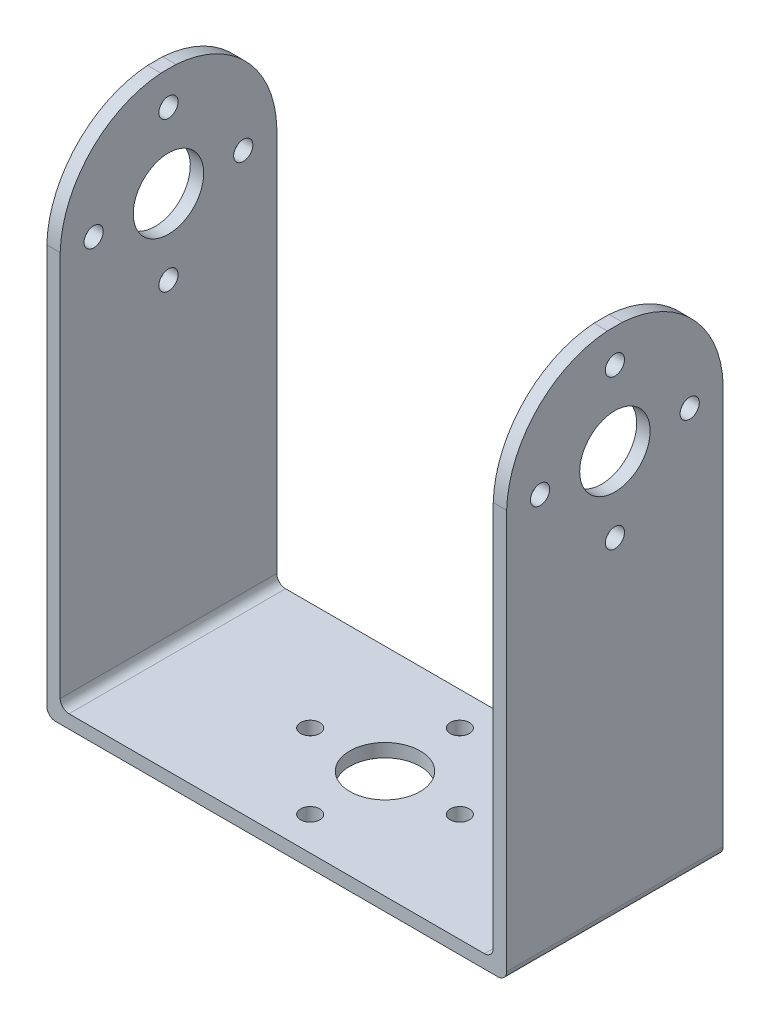
ISO-10303-21;
HEADER;
FILE_DESCRIPTION(('STEP AP214'),'2;1');
FILE_NAME('part.step','',(''),(''),'','','');
FILE_SCHEMA(('AUTOMOTIVE_DESIGN { 1 0 10303 214 1 1 1 1 }'));
ENDSEC;
DATA;
#1=APPLICATION_CONTEXT('core data for automotive mechanical design processes');
#2=APPLICATION_PROTOCOL_DEFINITION('international standard','automotive_design',2000,#1);
#3=PRODUCT_CONTEXT('',#1,'mechanical');
#4=PRODUCT('Part','Part','',(#3));
#5=PRODUCT_RELATED_PRODUCT_CATEGORY('part','',(#4));
#6=PRODUCT_DEFINITION_FORMATION('','',#4);
#7=PRODUCT_DEFINITION_CONTEXT('part definition',#1,'design');
#8=PRODUCT_DEFINITION('design','',#6,#7);
#9=PRODUCT_DEFINITION_SHAPE('','',#8);
#10=(LENGTH_UNIT() NAMED_UNIT(*) SI_UNIT(.MILLI.,.METRE.));
#11=(NAMED_UNIT(*) PLANE_ANGLE_UNIT() SI_UNIT($,.RADIAN.));
#12=(NAMED_UNIT(*) SI_UNIT($,.STERADIAN.) SOLID_ANGLE_UNIT());
#13=UNCERTAINTY_MEASURE_WITH_UNIT(LENGTH_MEASURE(1.E-05),#10,'distance_accuracy_value','');
#14=(GEOMETRIC_REPRESENTATION_CONTEXT(3) GLOBAL_UNCERTAINTY_ASSIGNED_CONTEXT((#13)) GLOBAL_UNIT_ASSIGNED_CONTEXT((#10,
#11,#12)) REPRESENTATION_CONTEXT('',''));
#15=CARTESIAN_POINT('',(0.,0.,0.));
#16=DIRECTION('',(0.,0.,1.));
#17=DIRECTION('',(1.,0.,0.));
#18=AXIS2_PLACEMENT_3D('',#15,#16,#17);
#19=CARTESIAN_POINT('',(-24.605,58.34,24.61));
#20=DIRECTION('',(0.,-1.,0.));
#21=DIRECTION('',(0.,0.,-1.));
#22=AXIS2_PLACEMENT_3D('',#19,#20,#21);
#23=PLANE('',#22);
#24=DIRECTION('',(-1.,0.,0.));
#25=VECTOR('',#24,1.);
#26=CARTESIAN_POINT('',(-6.125,58.34,13.1638946384744));
#27=LINE('',#26,#25);
#28=CARTESIAN_POINT('',(-24.605,58.34,13.1638946384744));
#29=VERTEX_POINT('',#28);
#30=CARTESIAN_POINT('',(-26.125,58.34,13.1638946384744));
#31=VERTEX_POINT('',#30);
#32=EDGE_CURVE('E368',#29,#31,#27,.T.);
#33=ORIENTED_EDGE('',*,*,#32,.F.);
#34=DIRECTION('',(0.,0.,-1.));
#35=VECTOR('',#34,1.);
#36=CARTESIAN_POINT('',(-24.605,58.34,24.61));
#37=LINE('',#36,#35);
#38=CARTESIAN_POINT('',(-24.605,58.34,11.4461053615256));
#39=VERTEX_POINT('',#38);
#40=EDGE_CURVE('E225',#29,#39,#37,.T.);
#41=ORIENTED_EDGE('',*,*,#40,.T.);
#42=DIRECTION('',(-1.,0.,0.));
#43=VECTOR('',#42,1.);
#44=CARTESIAN_POINT('',(-6.125,58.34,11.4461053615256));
#45=LINE('',#44,#43);
#46=CARTESIAN_POINT('',(-26.125,58.34,11.4461053615256));
#47=VERTEX_POINT('',#46);
#48=EDGE_CURVE('E373',#39,#47,#45,.T.);
#49=ORIENTED_EDGE('',*,*,#48,.T.);
#50=DIRECTION('',(0.,0.,-1.));
#51=VECTOR('',#50,1.);
#52=CARTESIAN_POINT('',(-26.125,58.34,24.61));
#53=LINE('',#52,#51);
#54=EDGE_CURVE('E221',#31,#47,#53,.T.);
#55=ORIENTED_EDGE('',*,*,#54,.F.);
#56=EDGE_LOOP('',(#33,#41,#49,#55));
#57=FACE_BOUND('',#56,.T.);
#58=ADVANCED_FACE('F83',(#57),#23,.F.);
#59=CARTESIAN_POINT('',(-26.125,58.34,24.61));
#60=DIRECTION('',(1.,0.,0.));
#61=DIRECTION('',(0.,1.,0.));
#62=AXIS2_PLACEMENT_3D('',#59,#60,#61);
#63=PLANE('',#62);
#64=CARTESIAN_POINT('',(-26.125,46.0600000000001,20.805));
#65=DIRECTION('',(-1.,0.,0.));
#66=DIRECTION('',(0.,0.,-1.));
#67=AXIS2_PLACEMENT_3D('',#64,#65,#66);
#68=CIRCLE('',#67,1.09);
#69=CARTESIAN_POINT('',(-26.125,46.0600000000001,19.715));
#70=VERTEX_POINT('',#69);
#71=EDGE_CURVE('E539',#70,#70,#68,.T.);
#72=ORIENTED_EDGE('',*,*,#71,.F.);
#73=EDGE_LOOP('',(#72));
#74=FACE_BOUND('',#73,.T.);
#75=CARTESIAN_POINT('',(-26.125,37.56,12.305));
#76=DIRECTION('',(-1.,0.,0.));
#77=DIRECTION('',(0.,1.,0.));
#78=AXIS2_PLACEMENT_3D('',#75,#76,#77);
#79=CIRCLE('',#78,1.09);
#80=CARTESIAN_POINT('',(-26.125,38.65,12.305));
#81=VERTEX_POINT('',#80);
#82=EDGE_CURVE('E545',#81,#81,#79,.T.);
#83=ORIENTED_EDGE('',*,*,#82,.F.);
#84=EDGE_LOOP('',(#83));
#85=FACE_BOUND('',#84,.T.);
#86=CARTESIAN_POINT('',(-26.125,46.06,3.805));
#87=DIRECTION('',(-1.,0.,0.));
#88=DIRECTION('',(0.,0.,1.));
#89=AXIS2_PLACEMENT_3D('',#86,#87,#88);
#90=CIRCLE('',#89,1.09);
#91=CARTESIAN_POINT('',(-26.125,46.06,4.895));
#92=VERTEX_POINT('',#91);
#93=EDGE_CURVE('E551',#92,#92,#90,.T.);
#94=ORIENTED_EDGE('',*,*,#93,.F.);
#95=EDGE_LOOP('',(#94));
#96=FACE_BOUND('',#95,.T.);
#97=CARTESIAN_POINT('',(-26.125,54.56,12.305));
#98=DIRECTION('',(-1.,0.,0.));
#99=DIRECTION('',(0.,-1.,0.));
#100=AXIS2_PLACEMENT_3D('',#97,#98,#99);
#101=CIRCLE('',#100,1.09);
#102=CARTESIAN_POINT('',(-26.125,53.47,12.305));
#103=VERTEX_POINT('',#102);
#104=EDGE_CURVE('E251',#103,#103,#101,.T.);
#105=ORIENTED_EDGE('',*,*,#104,.F.);
#106=EDGE_LOOP('',(#105));
#107=FACE_BOUND('',#106,.T.);
#108=CARTESIAN_POINT('',(-26.125,46.06,12.305));
#109=DIRECTION('',(-1.,0.,0.));
#110=DIRECTION('',(0.,0.,1.));
#111=AXIS2_PLACEMENT_3D('',#108,#109,#110);
#112=CIRCLE('',#111,4.);
#113=CARTESIAN_POINT('',(-26.125,46.06,16.305));
#114=VERTEX_POINT('',#113);
#115=EDGE_CURVE('E238',#114,#114,#112,.T.);
#116=ORIENTED_EDGE('',*,*,#115,.F.);
#117=EDGE_LOOP('',(#116));
#118=FACE_BOUND('',#117,.T.);
#119=DIRECTION('',(0.,-1.,0.));
#120=VECTOR('',#119,1.);
#121=CARTESIAN_POINT('',(-26.125,58.34,0.));
#122=LINE('',#121,#120);
#123=CARTESIAN_POINT('',(-26.125,46.4108204669057,0.));
#124=VERTEX_POINT('',#123);
#125=CARTESIAN_POINT('',(-26.125,1.00000000000001,0.));
#126=VERTEX_POINT('',#125);
#127=EDGE_CURVE('E323',#124,#126,#122,.T.);
#128=ORIENTED_EDGE('',*,*,#127,.T.);
#129=DIRECTION('',(0.,0.,-1.));
#130=VECTOR('',#129,1.);
#131=CARTESIAN_POINT('',(-26.125,1.,24.61));
#132=LINE('',#131,#130);
#133=CARTESIAN_POINT('',(-26.125,1.00000000000001,24.61));
#134=VERTEX_POINT('',#133);
#135=EDGE_CURVE('E98',#126,#134,#132,.F.);
#136=ORIENTED_EDGE('',*,*,#135,.T.);
#137=DIRECTION('',(0.,-1.,0.));
#138=VECTOR('',#137,1.);
#139=CARTESIAN_POINT('',(-26.125,58.34,24.61));
#140=LINE('',#139,#138);
#141=CARTESIAN_POINT('',(-26.125,46.4108204669058,24.61));
#142=VERTEX_POINT('',#141);
#143=EDGE_CURVE('E333',#142,#134,#140,.T.);
#144=ORIENTED_EDGE('',*,*,#143,.F.);
#145=CARTESIAN_POINT('',(-26.125,46.06,12.305));
#146=DIRECTION('',(-1.,0.,0.));
#147=DIRECTION('',(0.,0.,1.));
#148=AXIS2_PLACEMENT_3D('',#145,#146,#147);
#149=CIRCLE('',#148,12.31);
#150=EDGE_CURVE('E237',#142,#31,#149,.T.);
#151=ORIENTED_EDGE('',*,*,#150,.T.);
#152=ORIENTED_EDGE('',*,*,#54,.T.);
#153=CARTESIAN_POINT('',(-26.125,46.06,12.305));
#154=DIRECTION('',(-1.,0.,0.));
#155=DIRECTION('',(0.,0.,1.));
#156=AXIS2_PLACEMENT_3D('',#153,#154,#155);
#157=CIRCLE('',#156,12.31);
#158=EDGE_CURVE('E371',#47,#124,#157,.T.);
#159=ORIENTED_EDGE('',*,*,#158,.T.);
#160=EDGE_LOOP('',(#128,#136,#144,#151,#152,#159));
#161=FACE_BOUND('',#160,.T.);
#162=ADVANCED_FACE('F383',(#74,#85,#96,#107,#118,#161),#63,.F.);
#163=CARTESIAN_POINT('',(-24.605,1.51999999999999,24.61));
#164=DIRECTION('',(-1.,0.,0.));
#165=DIRECTION('',(0.,-1.,0.));
#166=AXIS2_PLACEMENT_3D('',#163,#164,#165);
#167=PLANE('',#166);
#168=CARTESIAN_POINT('',(-24.605,46.0600000000001,20.805));
#169=DIRECTION('',(-1.,0.,0.));
#170=DIRECTION('',(0.,0.,-1.));
#171=AXIS2_PLACEMENT_3D('',#168,#169,#170);
#172=CIRCLE('',#171,1.09);
#173=CARTESIAN_POINT('',(-24.605,46.0600000000001,19.715));
#174=VERTEX_POINT('',#173);
#175=EDGE_CURVE('E542',#174,#174,#172,.T.);
#176=ORIENTED_EDGE('',*,*,#175,.T.);
#177=EDGE_LOOP('',(#176));
#178=FACE_BOUND('',#177,.T.);
#179=CARTESIAN_POINT('',(-24.605,37.56,12.305));
#180=DIRECTION('',(-1.,0.,0.));
#181=DIRECTION('',(0.,1.,0.));
#182=AXIS2_PLACEMENT_3D('',#179,#180,#181);
#183=CIRCLE('',#182,1.09);
#184=CARTESIAN_POINT('',(-24.605,38.65,12.305));
#185=VERTEX_POINT('',#184);
#186=EDGE_CURVE('E548',#185,#185,#183,.T.);
#187=ORIENTED_EDGE('',*,*,#186,.T.);
#188=EDGE_LOOP('',(#187));
#189=FACE_BOUND('',#188,.T.);
#190=CARTESIAN_POINT('',(-24.605,46.06,3.805));
#191=DIRECTION('',(-1.,0.,0.));
#192=DIRECTION('',(0.,0.,1.));
#193=AXIS2_PLACEMENT_3D('',#190,#191,#192);
#194=CIRCLE('',#193,1.09);
#195=CARTESIAN_POINT('',(-24.605,46.06,4.895));
#196=VERTEX_POINT('',#195);
#197=EDGE_CURVE('E554',#196,#196,#194,.T.);
#198=ORIENTED_EDGE('',*,*,#197,.T.);
#199=EDGE_LOOP('',(#198));
#200=FACE_BOUND('',#199,.T.);
#201=CARTESIAN_POINT('',(-24.605,54.56,12.305));
#202=DIRECTION('',(-1.,0.,0.));
#203=DIRECTION('',(0.,-1.,0.));
#204=AXIS2_PLACEMENT_3D('',#201,#202,#203);
#205=CIRCLE('',#204,1.09);
#206=CARTESIAN_POINT('',(-24.605,53.47,12.305));
#207=VERTEX_POINT('',#206);
#208=EDGE_CURVE('E561',#207,#207,#205,.T.);
#209=ORIENTED_EDGE('',*,*,#208,.T.);
#210=EDGE_LOOP('',(#209));
#211=FACE_BOUND('',#210,.T.);
#212=CARTESIAN_POINT('',(-24.605,46.06,12.305));
#213=DIRECTION('',(-1.,0.,0.));
#214=DIRECTION('',(0.,-1.,0.));
#215=AXIS2_PLACEMENT_3D('',#212,#213,#214);
#216=CIRCLE('',#215,4.);
#217=CARTESIAN_POINT('',(-24.605,42.06,12.305));
#218=VERTEX_POINT('',#217);
#219=EDGE_CURVE('E234',#218,#218,#216,.T.);
#220=ORIENTED_EDGE('',*,*,#219,.T.);
#221=EDGE_LOOP('',(#220));
#222=FACE_BOUND('',#221,.T.);
#223=DIRECTION('',(0.,1.,0.));
#224=VECTOR('',#223,1.);
#225=CARTESIAN_POINT('',(-24.605,1.51999999999999,24.61));
#226=LINE('',#225,#224);
#227=CARTESIAN_POINT('',(-24.605,2.51999999999999,24.61));
#228=VERTEX_POINT('',#227);
#229=CARTESIAN_POINT('',(-24.605,46.4108204669057,24.61));
#230=VERTEX_POINT('',#229);
#231=EDGE_CURVE('E313',#228,#230,#226,.T.);
#232=ORIENTED_EDGE('',*,*,#231,.F.);
#233=DIRECTION('',(0.,0.,-1.));
#234=VECTOR('',#233,1.);
#235=CARTESIAN_POINT('',(-24.605,2.51999999999999,0.));
#236=LINE('',#235,#234);
#237=CARTESIAN_POINT('',(-24.605,2.51999999999999,0.));
#238=VERTEX_POINT('',#237);
#239=EDGE_CURVE('E284',#228,#238,#236,.T.);
#240=ORIENTED_EDGE('',*,*,#239,.T.);
#241=DIRECTION('',(0.,1.,0.));
#242=VECTOR('',#241,1.);
#243=CARTESIAN_POINT('',(-24.605,1.51999999999999,0.));
#244=LINE('',#243,#242);
#245=CARTESIAN_POINT('',(-24.605,46.4108204669057,0.));
#246=VERTEX_POINT('',#245);
#247=EDGE_CURVE('E298',#238,#246,#244,.T.);
#248=ORIENTED_EDGE('',*,*,#247,.T.);
#249=CARTESIAN_POINT('',(-24.605,46.06,12.305));
#250=DIRECTION('',(-1.,0.,0.));
#251=DIRECTION('',(0.,-1.,0.));
#252=AXIS2_PLACEMENT_3D('',#249,#250,#251);
#253=CIRCLE('',#252,12.31);
#254=EDGE_CURVE('E326',#39,#246,#253,.T.);
#255=ORIENTED_EDGE('',*,*,#254,.F.);
#256=ORIENTED_EDGE('',*,*,#40,.F.);
#257=CARTESIAN_POINT('',(-24.605,46.06,12.305));
#258=DIRECTION('',(-1.,0.,0.));
#259=DIRECTION('',(0.,-1.,0.));
#260=AXIS2_PLACEMENT_3D('',#257,#258,#259);
#261=CIRCLE('',#260,12.31);
#262=EDGE_CURVE('E315',#230,#29,#261,.T.);
#263=ORIENTED_EDGE('',*,*,#262,.F.);
#264=EDGE_LOOP('',(#232,#240,#248,#255,#256,#263));
#265=FACE_BOUND('',#264,.T.);
#266=ADVANCED_FACE('F309',(#178,#189,#200,#211,#222,#265),#167,.F.);
#267=CARTESIAN_POINT('',(0.,0.,24.61));
#268=DIRECTION('',(0.,0.,1.));
#269=DIRECTION('',(1.,0.,0.));
#270=AXIS2_PLACEMENT_3D('',#267,#268,#269);
#271=PLANE('',#270);
#272=DIRECTION('',(1.,0.,0.));
#273=VECTOR('',#272,1.);
#274=CARTESIAN_POINT('',(-26.125,0.,24.61));
#275=LINE('',#274,#273);
#276=CARTESIAN_POINT('',(-25.125,0.,24.61));
#277=VERTEX_POINT('',#276);
#278=CARTESIAN_POINT('',(25.125,0.,24.61));
#279=VERTEX_POINT('',#278);
#280=EDGE_CURVE('E334',#277,#279,#275,.T.);
#281=ORIENTED_EDGE('',*,*,#280,.T.);
#282=CARTESIAN_POINT('',(25.125,1.,24.61));
#283=DIRECTION('',(0.,0.,1.));
#284=DIRECTION('',(1.,0.,0.));
#285=AXIS2_PLACEMENT_3D('',#282,#283,#284);
#286=CIRCLE('',#285,1.);
#287=CARTESIAN_POINT('',(26.125,1.,24.61));
#288=VERTEX_POINT('',#287);
#289=EDGE_CURVE('E274',#279,#288,#286,.T.);
#290=ORIENTED_EDGE('',*,*,#289,.T.);
#291=DIRECTION('',(0.,1.,0.));
#292=VECTOR('',#291,1.);
#293=CARTESIAN_POINT('',(26.125,0.,24.61));
#294=LINE('',#293,#292);
#295=CARTESIAN_POINT('',(26.125,46.4108204669058,24.61));
#296=VERTEX_POINT('',#295);
#297=EDGE_CURVE('E338',#288,#296,#294,.T.);
#298=ORIENTED_EDGE('',*,*,#297,.T.);
#299=DIRECTION('',(1.,0.,0.));
#300=VECTOR('',#299,1.);
#301=CARTESIAN_POINT('',(6.125,46.4108204669057,24.61));
#302=LINE('',#301,#300);
#303=CARTESIAN_POINT('',(24.605,46.4108204669057,24.61));
#304=VERTEX_POINT('',#303);
#305=EDGE_CURVE('E203',#304,#296,#302,.T.);
#306=ORIENTED_EDGE('',*,*,#305,.F.);
#307=DIRECTION('',(0.,-1.,0.));
#308=VECTOR('',#307,1.);
#309=CARTESIAN_POINT('',(24.605,58.34,24.61));
#310=LINE('',#309,#308);
#311=CARTESIAN_POINT('',(24.605,2.52,24.61));
#312=VERTEX_POINT('',#311);
#313=EDGE_CURVE('E319',#304,#312,#310,.T.);
#314=ORIENTED_EDGE('',*,*,#313,.T.);
#315=CARTESIAN_POINT('',(23.605,2.52,24.61));
#316=DIRECTION('',(0.,0.,1.));
#317=DIRECTION('',(1.,0.,0.));
#318=AXIS2_PLACEMENT_3D('',#315,#316,#317);
#319=CIRCLE('',#318,1.);
#320=CARTESIAN_POINT('',(23.605,1.52,24.61));
#321=VERTEX_POINT('',#320);
#322=EDGE_CURVE('E289',#312,#321,#319,.F.);
#323=ORIENTED_EDGE('',*,*,#322,.T.);
#324=DIRECTION('',(-1.,0.,0.));
#325=VECTOR('',#324,1.);
#326=CARTESIAN_POINT('',(24.605,1.52,24.61));
#327=LINE('',#326,#325);
#328=CARTESIAN_POINT('',(-23.605,1.51999999999999,24.61));
#329=VERTEX_POINT('',#328);
#330=EDGE_CURVE('E317',#321,#329,#327,.T.);
#331=ORIENTED_EDGE('',*,*,#330,.T.);
#332=CARTESIAN_POINT('',(-23.605,2.51999999999999,24.61));
#333=DIRECTION('',(0.,0.,1.));
#334=DIRECTION('',(1.,0.,0.));
#335=AXIS2_PLACEMENT_3D('',#332,#333,#334);
#336=CIRCLE('',#335,1.);
#337=EDGE_CURVE('E12',#329,#228,#336,.F.);
#338=ORIENTED_EDGE('',*,*,#337,.T.);
#339=ORIENTED_EDGE('',*,*,#231,.T.);
#340=DIRECTION('',(-1.,0.,0.));
#341=VECTOR('',#340,1.);
#342=CARTESIAN_POINT('',(-6.125,46.4108204669057,24.61));
#343=LINE('',#342,#341);
#344=EDGE_CURVE('E230',#230,#142,#343,.T.);
#345=ORIENTED_EDGE('',*,*,#344,.T.);
#346=ORIENTED_EDGE('',*,*,#143,.T.);
#347=CARTESIAN_POINT('',(-25.125,1.,24.61));
#348=DIRECTION('',(0.,0.,1.));
#349=DIRECTION('',(1.,0.,0.));
#350=AXIS2_PLACEMENT_3D('',#347,#348,#349);
#351=CIRCLE('',#350,1.);
#352=EDGE_CURVE('E272',#134,#277,#351,.T.);
#353=ORIENTED_EDGE('',*,*,#352,.T.);
#354=EDGE_LOOP('',(#281,#290,#298,#306,#314,#323,#331,#338,#339,#345,#346,#353));
#355=FACE_BOUND('',#354,.T.);
#356=ADVANCED_FACE('F346',(#355),#271,.T.);
#357=CARTESIAN_POINT('',(0.,0.,0.));
#358=DIRECTION('',(0.,0.,1.));
#359=DIRECTION('',(1.,0.,0.));
#360=AXIS2_PLACEMENT_3D('',#357,#358,#359);
#361=PLANE('',#360);
#362=DIRECTION('',(0.,1.,0.));
#363=VECTOR('',#362,1.);
#364=CARTESIAN_POINT('',(26.125,0.,0.));
#365=LINE('',#364,#363);
#366=CARTESIAN_POINT('',(26.125,1.,0.));
#367=VERTEX_POINT('',#366);
#368=CARTESIAN_POINT('',(26.125,46.4108204669058,0.));
#369=VERTEX_POINT('',#368);
#370=EDGE_CURVE('E329',#367,#369,#365,.T.);
#371=ORIENTED_EDGE('',*,*,#370,.F.);
#372=CARTESIAN_POINT('',(25.125,1.,0.));
#373=DIRECTION('',(0.,0.,1.));
#374=DIRECTION('',(1.,0.,0.));
#375=AXIS2_PLACEMENT_3D('',#372,#373,#374);
#376=CIRCLE('',#375,1.);
#377=CARTESIAN_POINT('',(25.125,0.,0.));
#378=VERTEX_POINT('',#377);
#379=EDGE_CURVE('E265',#367,#378,#376,.F.);
#380=ORIENTED_EDGE('',*,*,#379,.T.);
#381=DIRECTION('',(1.,0.,0.));
#382=VECTOR('',#381,1.);
#383=CARTESIAN_POINT('',(-26.125,0.,0.));
#384=LINE('',#383,#382);
#385=CARTESIAN_POINT('',(-25.125,0.,0.));
#386=VERTEX_POINT('',#385);
#387=EDGE_CURVE('E325',#386,#378,#384,.T.);
#388=ORIENTED_EDGE('',*,*,#387,.F.);
#389=CARTESIAN_POINT('',(-25.125,1.,0.));
#390=DIRECTION('',(0.,0.,1.));
#391=DIRECTION('',(1.,0.,0.));
#392=AXIS2_PLACEMENT_3D('',#389,#390,#391);
#393=CIRCLE('',#392,1.);
#394=EDGE_CURVE('E263',#386,#126,#393,.F.);
#395=ORIENTED_EDGE('',*,*,#394,.T.);
#396=ORIENTED_EDGE('',*,*,#127,.F.);
#397=DIRECTION('',(-1.,0.,0.));
#398=VECTOR('',#397,1.);
#399=CARTESIAN_POINT('',(-6.125,46.4108204669057,0.));
#400=LINE('',#399,#398);
#401=EDGE_CURVE('E223',#246,#124,#400,.T.);
#402=ORIENTED_EDGE('',*,*,#401,.F.);
#403=ORIENTED_EDGE('',*,*,#247,.F.);
#404=CARTESIAN_POINT('',(-23.605,2.51999999999999,0.));
#405=DIRECTION('',(0.,0.,1.));
#406=DIRECTION('',(1.,0.,0.));
#407=AXIS2_PLACEMENT_3D('',#404,#405,#406);
#408=CIRCLE('',#407,1.);
#409=CARTESIAN_POINT('',(-23.605,1.51999999999999,0.));
#410=VERTEX_POINT('',#409);
#411=EDGE_CURVE('E91',#238,#410,#408,.T.);
#412=ORIENTED_EDGE('',*,*,#411,.T.);
#413=DIRECTION('',(-1.,0.,0.));
#414=VECTOR('',#413,1.);
#415=CARTESIAN_POINT('',(24.605,1.52,0.));
#416=LINE('',#415,#414);
#417=CARTESIAN_POINT('',(23.605,1.52,0.));
#418=VERTEX_POINT('',#417);
#419=EDGE_CURVE('E296',#418,#410,#416,.T.);
#420=ORIENTED_EDGE('',*,*,#419,.F.);
#421=CARTESIAN_POINT('',(23.605,2.52,0.));
#422=DIRECTION('',(0.,0.,1.));
#423=DIRECTION('',(1.,0.,0.));
#424=AXIS2_PLACEMENT_3D('',#421,#422,#423);
#425=CIRCLE('',#424,1.);
#426=CARTESIAN_POINT('',(24.605,2.52,0.));
#427=VERTEX_POINT('',#426);
#428=EDGE_CURVE('E287',#418,#427,#425,.T.);
#429=ORIENTED_EDGE('',*,*,#428,.T.);
#430=DIRECTION('',(0.,-1.,0.));
#431=VECTOR('',#430,1.);
#432=CARTESIAN_POINT('',(24.605,58.34,0.));
#433=LINE('',#432,#431);
#434=CARTESIAN_POINT('',(24.605,46.4108204669057,0.));
#435=VERTEX_POINT('',#434);
#436=EDGE_CURVE('E306',#435,#427,#433,.T.);
#437=ORIENTED_EDGE('',*,*,#436,.F.);
#438=DIRECTION('',(1.,0.,0.));
#439=VECTOR('',#438,1.);
#440=CARTESIAN_POINT('',(6.125,46.4108204669057,0.));
#441=LINE('',#440,#439);
#442=EDGE_CURVE('E358',#435,#369,#441,.T.);
#443=ORIENTED_EDGE('',*,*,#442,.T.);
#444=EDGE_LOOP('',(#371,#380,#388,#395,#396,#402,#403,#412,#420,#429,#437,#443));
#445=FACE_BOUND('',#444,.T.);
#446=ADVANCED_FACE('F295',(#445),#361,.F.);
#447=CARTESIAN_POINT('',(-26.125,0.,24.61));
#448=DIRECTION('',(0.,1.,0.));
#449=DIRECTION('',(0.,0.,1.));
#450=AXIS2_PLACEMENT_3D('',#447,#448,#449);
#451=PLANE('',#450);
#452=CARTESIAN_POINT('',(-8.49999999999999,0.,12.3049999999999));
#453=DIRECTION('',(0.,1.,0.));
#454=DIRECTION('',(1.,0.,0.));
#455=AXIS2_PLACEMENT_3D('',#452,#453,#454);
#456=CIRCLE('',#455,1.09);
#457=CARTESIAN_POINT('',(-7.40999999999999,0.,12.3049999999999));
#458=VERTEX_POINT('',#457);
#459=EDGE_CURVE('E511',#458,#458,#456,.T.);
#460=ORIENTED_EDGE('',*,*,#459,.T.);
#461=EDGE_LOOP('',(#460));
#462=FACE_BOUND('',#461,.T.);
#463=CARTESIAN_POINT('',(0.,0.,20.805));
#464=DIRECTION('',(0.,1.,0.));
#465=DIRECTION('',(0.,0.,-1.));
#466=AXIS2_PLACEMENT_3D('',#463,#464,#465);
#467=CIRCLE('',#466,1.09);
#468=CARTESIAN_POINT('',(0.,0.,19.715));
#469=VERTEX_POINT('',#468);
#470=EDGE_CURVE('E505',#469,#469,#467,.T.);
#471=ORIENTED_EDGE('',*,*,#470,.T.);
#472=EDGE_LOOP('',(#471));
#473=FACE_BOUND('',#472,.T.);
#474=CARTESIAN_POINT('',(8.50000000000001,0.,12.305));
#475=DIRECTION('',(0.,1.,0.));
#476=DIRECTION('',(-1.,0.,0.));
#477=AXIS2_PLACEMENT_3D('',#474,#475,#476);
#478=CIRCLE('',#477,1.09);
#479=CARTESIAN_POINT('',(7.41000000000001,0.,12.305));
#480=VERTEX_POINT('',#479);
#481=EDGE_CURVE('E260',#480,#480,#478,.T.);
#482=ORIENTED_EDGE('',*,*,#481,.T.);
#483=EDGE_LOOP('',(#482));
#484=FACE_BOUND('',#483,.T.);
#485=CARTESIAN_POINT('',(0.,0.,3.805));
#486=DIRECTION('',(0.,1.,0.));
#487=DIRECTION('',(0.,0.,1.));
#488=AXIS2_PLACEMENT_3D('',#485,#486,#487);
#489=CIRCLE('',#488,1.09);
#490=CARTESIAN_POINT('',(0.,0.,4.895));
#491=VERTEX_POINT('',#490);
#492=EDGE_CURVE('E256',#491,#491,#489,.T.);
#493=ORIENTED_EDGE('',*,*,#492,.T.);
#494=EDGE_LOOP('',(#493));
#495=FACE_BOUND('',#494,.T.);
#496=CARTESIAN_POINT('',(0.,0.,12.305));
#497=DIRECTION('',(0.,1.,0.));
#498=DIRECTION('',(0.,0.,1.));
#499=AXIS2_PLACEMENT_3D('',#496,#497,#498);
#500=CIRCLE('',#499,4.);
#501=CARTESIAN_POINT('',(0.,0.,16.305));
#502=VERTEX_POINT('',#501);
#503=EDGE_CURVE('E255',#502,#502,#500,.T.);
#504=ORIENTED_EDGE('',*,*,#503,.T.);
#505=EDGE_LOOP('',(#504));
#506=FACE_BOUND('',#505,.T.);
#507=ORIENTED_EDGE('',*,*,#387,.T.);
#508=DIRECTION('',(0.,0.,-1.));
#509=VECTOR('',#508,1.);
#510=CARTESIAN_POINT('',(25.125,0.,24.61));
#511=LINE('',#510,#509);
#512=EDGE_CURVE('E270',#378,#279,#511,.F.);
#513=ORIENTED_EDGE('',*,*,#512,.T.);
#514=ORIENTED_EDGE('',*,*,#280,.F.);
#515=DIRECTION('',(0.,0.,-1.));
#516=VECTOR('',#515,1.);
#517=CARTESIAN_POINT('',(-25.125,0.,24.61));
#518=LINE('',#517,#516);
#519=EDGE_CURVE('E267',#277,#386,#518,.T.);
#520=ORIENTED_EDGE('',*,*,#519,.T.);
#521=EDGE_LOOP('',(#507,#513,#514,#520));
#522=FACE_BOUND('',#521,.T.);
#523=ADVANCED_FACE('F390',(#462,#473,#484,#495,#506,#522),#451,.F.);
#524=CARTESIAN_POINT('',(26.125,0.,24.61));
#525=DIRECTION('',(-1.,0.,0.));
#526=DIRECTION('',(0.,-1.,0.));
#527=AXIS2_PLACEMENT_3D('',#524,#525,#526);
#528=PLANE('',#527);
#529=CARTESIAN_POINT('',(26.125,46.0600000000001,20.805));
#530=DIRECTION('',(-1.,0.,0.));
#531=DIRECTION('',(0.,0.,-1.));
#532=AXIS2_PLACEMENT_3D('',#529,#530,#531);
#533=CIRCLE('',#532,1.09);
#534=CARTESIAN_POINT('',(26.125,46.0600000000001,19.715));
#535=VERTEX_POINT('',#534);
#536=EDGE_CURVE('E524',#535,#535,#533,.T.);
#537=ORIENTED_EDGE('',*,*,#536,.T.);
#538=EDGE_LOOP('',(#537));
#539=FACE_BOUND('',#538,.T.);
#540=CARTESIAN_POINT('',(26.125,37.56,12.305));
#541=DIRECTION('',(-1.,0.,0.));
#542=DIRECTION('',(0.,1.,0.));
#543=AXIS2_PLACEMENT_3D('',#540,#541,#542);
#544=CIRCLE('',#543,1.09);
#545=CARTESIAN_POINT('',(26.125,38.65,12.305));
#546=VERTEX_POINT('',#545);
#547=EDGE_CURVE('E530',#546,#546,#544,.T.);
#548=ORIENTED_EDGE('',*,*,#547,.T.);
#549=EDGE_LOOP('',(#548));
#550=FACE_BOUND('',#549,.T.);
#551=CARTESIAN_POINT('',(26.125,46.06,3.80499999999999));
#552=DIRECTION('',(-1.,0.,0.));
#553=DIRECTION('',(0.,0.,1.));
#554=AXIS2_PLACEMENT_3D('',#551,#552,#553);
#555=CIRCLE('',#554,1.09);
#556=CARTESIAN_POINT('',(26.125,46.06,4.89499999999999));
#557=VERTEX_POINT('',#556);
#558=EDGE_CURVE('E536',#557,#557,#555,.T.);
#559=ORIENTED_EDGE('',*,*,#558,.T.);
#560=EDGE_LOOP('',(#559));
#561=FACE_BOUND('',#560,.T.);
#562=CARTESIAN_POINT('',(26.125,54.56,12.305));
#563=DIRECTION('',(-1.,0.,0.));
#564=DIRECTION('',(0.,-1.,0.));
#565=AXIS2_PLACEMENT_3D('',#562,#563,#564);
#566=CIRCLE('',#565,1.09);
#567=CARTESIAN_POINT('',(26.125,53.47,12.305));
#568=VERTEX_POINT('',#567);
#569=EDGE_CURVE('E250',#568,#568,#566,.T.);
#570=ORIENTED_EDGE('',*,*,#569,.T.);
#571=EDGE_LOOP('',(#570));
#572=FACE_BOUND('',#571,.T.);
#573=CARTESIAN_POINT('',(26.125,46.06,12.305));
#574=DIRECTION('',(-1.,0.,0.));
#575=DIRECTION('',(0.,0.,1.));
#576=AXIS2_PLACEMENT_3D('',#573,#574,#575);
#577=CIRCLE('',#576,4.);
#578=CARTESIAN_POINT('',(26.125,46.06,16.305));
#579=VERTEX_POINT('',#578);
#580=EDGE_CURVE('E246',#579,#579,#577,.T.);
#581=ORIENTED_EDGE('',*,*,#580,.T.);
#582=EDGE_LOOP('',(#581));
#583=FACE_BOUND('',#582,.T.);
#584=ORIENTED_EDGE('',*,*,#297,.F.);
#585=DIRECTION('',(0.,0.,-1.));
#586=VECTOR('',#585,1.);
#587=CARTESIAN_POINT('',(26.125,1.,24.61));
#588=LINE('',#587,#586);
#589=EDGE_CURVE('E243',#288,#367,#588,.T.);
#590=ORIENTED_EDGE('',*,*,#589,.T.);
#591=ORIENTED_EDGE('',*,*,#370,.T.);
#592=CARTESIAN_POINT('',(26.125,46.06,12.305));
#593=DIRECTION('',(-1.,0.,0.));
#594=DIRECTION('',(0.,0.,1.));
#595=AXIS2_PLACEMENT_3D('',#592,#593,#594);
#596=CIRCLE('',#595,12.31);
#597=CARTESIAN_POINT('',(26.125,58.34,11.4461053615256));
#598=VERTEX_POINT('',#597);
#599=EDGE_CURVE('E220',#598,#369,#596,.T.);
#600=ORIENTED_EDGE('',*,*,#599,.F.);
#601=DIRECTION('',(0.,0.,-1.));
#602=VECTOR('',#601,1.);
#603=CARTESIAN_POINT('',(26.125,58.34,24.61));
#604=LINE('',#603,#602);
#605=CARTESIAN_POINT('',(26.125,58.34,13.1638946384744));
#606=VERTEX_POINT('',#605);
#607=EDGE_CURVE('E213',#606,#598,#604,.T.);
#608=ORIENTED_EDGE('',*,*,#607,.F.);
#609=CARTESIAN_POINT('',(26.125,46.06,12.305));
#610=DIRECTION('',(-1.,0.,0.));
#611=DIRECTION('',(0.,0.,1.));
#612=AXIS2_PLACEMENT_3D('',#609,#610,#611);
#613=CIRCLE('',#612,12.31);
#614=EDGE_CURVE('E197',#296,#606,#613,.T.);
#615=ORIENTED_EDGE('',*,*,#614,.F.);
#616=EDGE_LOOP('',(#584,#590,#591,#600,#608,#615));
#617=FACE_BOUND('',#616,.T.);
#618=ADVANCED_FACE('F218',(#539,#550,#561,#572,#583,#617),#528,.F.);
#619=CARTESIAN_POINT('',(26.125,58.34,24.61));
#620=DIRECTION('',(0.,-1.,0.));
#621=DIRECTION('',(1.,0.,0.));
#622=AXIS2_PLACEMENT_3D('',#619,#620,#621);
#623=PLANE('',#622);
#624=DIRECTION('',(0.,0.,-1.));
#625=VECTOR('',#624,1.);
#626=CARTESIAN_POINT('',(24.605,58.34,24.61));
#627=LINE('',#626,#625);
#628=CARTESIAN_POINT('',(24.605,58.34,13.1638946384744));
#629=VERTEX_POINT('',#628);
#630=CARTESIAN_POINT('',(24.605,58.34,11.4461053615256));
#631=VERTEX_POINT('',#630);
#632=EDGE_CURVE('E215',#629,#631,#627,.T.);
#633=ORIENTED_EDGE('',*,*,#632,.F.);
#634=DIRECTION('',(1.,0.,0.));
#635=VECTOR('',#634,1.);
#636=CARTESIAN_POINT('',(6.125,58.34,13.1638946384744));
#637=LINE('',#636,#635);
#638=EDGE_CURVE('E200',#629,#606,#637,.T.);
#639=ORIENTED_EDGE('',*,*,#638,.T.);
#640=ORIENTED_EDGE('',*,*,#607,.T.);
#641=DIRECTION('',(1.,0.,0.));
#642=VECTOR('',#641,1.);
#643=CARTESIAN_POINT('',(6.125,58.34,11.4461053615256));
#644=LINE('',#643,#642);
#645=EDGE_CURVE('E357',#631,#598,#644,.T.);
#646=ORIENTED_EDGE('',*,*,#645,.F.);
#647=EDGE_LOOP('',(#633,#639,#640,#646));
#648=FACE_BOUND('',#647,.T.);
#649=ADVANCED_FACE('F211',(#648),#623,.F.);
#650=CARTESIAN_POINT('',(24.605,58.34,24.61));
#651=DIRECTION('',(1.,0.,0.));
#652=DIRECTION('',(0.,1.,0.));
#653=AXIS2_PLACEMENT_3D('',#650,#651,#652);
#654=PLANE('',#653);
#655=CARTESIAN_POINT('',(24.605,46.0600000000001,20.805));
#656=DIRECTION('',(1.,0.,0.));
#657=DIRECTION('',(0.,0.,1.));
#658=AXIS2_PLACEMENT_3D('',#655,#656,#657);
#659=CIRCLE('',#658,1.09);
#660=CARTESIAN_POINT('',(24.605,46.0600000000001,21.895));
#661=VERTEX_POINT('',#660);
#662=EDGE_CURVE('E521',#661,#661,#659,.T.);
#663=ORIENTED_EDGE('',*,*,#662,.T.);
#664=EDGE_LOOP('',(#663));
#665=FACE_BOUND('',#664,.T.);
#666=CARTESIAN_POINT('',(24.605,37.56,12.305));
#667=DIRECTION('',(1.,0.,0.));
#668=DIRECTION('',(0.,-1.,0.));
#669=AXIS2_PLACEMENT_3D('',#666,#667,#668);
#670=CIRCLE('',#669,1.09);
#671=CARTESIAN_POINT('',(24.605,36.47,12.305));
#672=VERTEX_POINT('',#671);
#673=EDGE_CURVE('E527',#672,#672,#670,.T.);
#674=ORIENTED_EDGE('',*,*,#673,.T.);
#675=EDGE_LOOP('',(#674));
#676=FACE_BOUND('',#675,.T.);
#677=CARTESIAN_POINT('',(24.605,46.06,3.80499999999999));
#678=DIRECTION('',(1.,0.,0.));
#679=DIRECTION('',(0.,0.,-1.));
#680=AXIS2_PLACEMENT_3D('',#677,#678,#679);
#681=CIRCLE('',#680,1.09);
#682=CARTESIAN_POINT('',(24.605,46.06,2.71499999999999));
#683=VERTEX_POINT('',#682);
#684=EDGE_CURVE('E533',#683,#683,#681,.T.);
#685=ORIENTED_EDGE('',*,*,#684,.T.);
#686=EDGE_LOOP('',(#685));
#687=FACE_BOUND('',#686,.T.);
#688=CARTESIAN_POINT('',(24.605,54.56,12.305));
#689=DIRECTION('',(1.,0.,0.));
#690=DIRECTION('',(0.,1.,0.));
#691=AXIS2_PLACEMENT_3D('',#688,#689,#690);
#692=CIRCLE('',#691,1.09);
#693=CARTESIAN_POINT('',(24.605,55.65,12.305));
#694=VERTEX_POINT('',#693);
#695=EDGE_CURVE('E247',#694,#694,#692,.T.);
#696=ORIENTED_EDGE('',*,*,#695,.T.);
#697=EDGE_LOOP('',(#696));
#698=FACE_BOUND('',#697,.T.);
#699=CARTESIAN_POINT('',(24.605,46.06,12.305));
#700=DIRECTION('',(1.,0.,0.));
#701=DIRECTION('',(0.,1.,0.));
#702=AXIS2_PLACEMENT_3D('',#699,#700,#701);
#703=CIRCLE('',#702,4.);
#704=CARTESIAN_POINT('',(24.605,50.06,12.305));
#705=VERTEX_POINT('',#704);
#706=EDGE_CURVE('E207',#705,#705,#703,.F.);
#707=ORIENTED_EDGE('',*,*,#706,.F.);
#708=EDGE_LOOP('',(#707));
#709=FACE_BOUND('',#708,.T.);
#710=ORIENTED_EDGE('',*,*,#436,.T.);
#711=DIRECTION('',(0.,0.,-1.));
#712=VECTOR('',#711,1.);
#713=CARTESIAN_POINT('',(24.605,2.52,24.61));
#714=LINE('',#713,#712);
#715=EDGE_CURVE('E282',#427,#312,#714,.F.);
#716=ORIENTED_EDGE('',*,*,#715,.T.);
#717=ORIENTED_EDGE('',*,*,#313,.F.);
#718=CARTESIAN_POINT('',(24.605,46.06,12.305));
#719=DIRECTION('',(1.,0.,0.));
#720=DIRECTION('',(0.,1.,0.));
#721=AXIS2_PLACEMENT_3D('',#718,#719,#720);
#722=CIRCLE('',#721,12.31);
#723=EDGE_CURVE('E241',#304,#629,#722,.F.);
#724=ORIENTED_EDGE('',*,*,#723,.T.);
#725=ORIENTED_EDGE('',*,*,#632,.T.);
#726=CARTESIAN_POINT('',(24.605,46.06,12.305));
#727=DIRECTION('',(1.,0.,0.));
#728=DIRECTION('',(0.,1.,0.));
#729=AXIS2_PLACEMENT_3D('',#726,#727,#728);
#730=CIRCLE('',#729,12.31);
#731=EDGE_CURVE('E233',#631,#435,#730,.F.);
#732=ORIENTED_EDGE('',*,*,#731,.T.);
#733=EDGE_LOOP('',(#710,#716,#717,#724,#725,#732));
#734=FACE_BOUND('',#733,.T.);
#735=ADVANCED_FACE('F353',(#665,#676,#687,#698,#709,#734),#654,.F.);
#736=CARTESIAN_POINT('',(24.605,1.52,24.61));
#737=DIRECTION('',(0.,-1.,0.));
#738=DIRECTION('',(1.,0.,0.));
#739=AXIS2_PLACEMENT_3D('',#736,#737,#738);
#740=PLANE('',#739);
#741=CARTESIAN_POINT('',(-8.49999999999999,1.51999999999999,12.3049999999999));
#742=DIRECTION('',(0.,-1.,0.));
#743=DIRECTION('',(0.,0.,-1.));
#744=AXIS2_PLACEMENT_3D('',#741,#742,#743);
#745=CIRCLE('',#744,1.09);
#746=CARTESIAN_POINT('',(-8.49999999999998,1.51999999999999,11.2149999999999));
#747=VERTEX_POINT('',#746);
#748=EDGE_CURVE('E818',#747,#747,#745,.T.);
#749=ORIENTED_EDGE('',*,*,#748,.T.);
#750=EDGE_LOOP('',(#749));
#751=FACE_BOUND('',#750,.T.);
#752=CARTESIAN_POINT('',(0.,1.51999999999999,20.805));
#753=DIRECTION('',(0.,-1.,0.));
#754=DIRECTION('',(-1.,0.,0.));
#755=AXIS2_PLACEMENT_3D('',#752,#753,#754);
#756=CIRCLE('',#755,1.09);
#757=CARTESIAN_POINT('',(-1.08999999999997,1.51999999999999,20.805));
#758=VERTEX_POINT('',#757);
#759=EDGE_CURVE('E502',#758,#758,#756,.T.);
#760=ORIENTED_EDGE('',*,*,#759,.T.);
#761=EDGE_LOOP('',(#760));
#762=FACE_BOUND('',#761,.T.);
#763=CARTESIAN_POINT('',(8.50000000000001,1.51999999999999,12.305));
#764=DIRECTION('',(0.,-1.,0.));
#765=DIRECTION('',(0.,0.,1.));
#766=AXIS2_PLACEMENT_3D('',#763,#764,#765);
#767=CIRCLE('',#766,1.09);
#768=CARTESIAN_POINT('',(8.50000000000001,1.51999999999999,13.395));
#769=VERTEX_POINT('',#768);
#770=EDGE_CURVE('E507',#769,#769,#767,.T.);
#771=ORIENTED_EDGE('',*,*,#770,.T.);
#772=EDGE_LOOP('',(#771));
#773=FACE_BOUND('',#772,.T.);
#774=CARTESIAN_POINT('',(0.,1.51999999999999,3.805));
#775=DIRECTION('',(0.,-1.,0.));
#776=DIRECTION('',(1.,0.,0.));
#777=AXIS2_PLACEMENT_3D('',#774,#775,#776);
#778=CIRCLE('',#777,1.09);
#779=CARTESIAN_POINT('',(1.09,1.51999999999999,3.805));
#780=VERTEX_POINT('',#779);
#781=EDGE_CURVE('E257',#780,#780,#778,.T.);
#782=ORIENTED_EDGE('',*,*,#781,.T.);
#783=EDGE_LOOP('',(#782));
#784=FACE_BOUND('',#783,.T.);
#785=CARTESIAN_POINT('',(0.,1.52,12.305));
#786=DIRECTION('',(0.,-1.,0.));
#787=DIRECTION('',(1.,0.,0.));
#788=AXIS2_PLACEMENT_3D('',#785,#786,#787);
#789=CIRCLE('',#788,4.);
#790=CARTESIAN_POINT('',(4.00000000000001,1.52,12.305));
#791=VERTEX_POINT('',#790);
#792=EDGE_CURVE('E252',#791,#791,#789,.T.);
#793=ORIENTED_EDGE('',*,*,#792,.T.);
#794=EDGE_LOOP('',(#793));
#795=FACE_BOUND('',#794,.T.);
#796=ORIENTED_EDGE('',*,*,#330,.F.);
#797=DIRECTION('',(0.,0.,-1.));
#798=VECTOR('',#797,1.);
#799=CARTESIAN_POINT('',(23.605,1.52,0.));
#800=LINE('',#799,#798);
#801=EDGE_CURVE('E279',#321,#418,#800,.T.);
#802=ORIENTED_EDGE('',*,*,#801,.T.);
#803=ORIENTED_EDGE('',*,*,#419,.T.);
#804=DIRECTION('',(0.,0.,-1.));
#805=VECTOR('',#804,1.);
#806=CARTESIAN_POINT('',(-23.605,1.51999999999999,24.61));
#807=LINE('',#806,#805);
#808=EDGE_CURVE('E277',#410,#329,#807,.F.);
#809=ORIENTED_EDGE('',*,*,#808,.T.);
#810=EDGE_LOOP('',(#796,#802,#803,#809));
#811=FACE_BOUND('',#810,.T.);
#812=ADVANCED_FACE('F304',(#751,#762,#773,#784,#795,#811),#740,.F.);
#813=CARTESIAN_POINT('',(-6.125,46.06,12.305));
#814=DIRECTION('',(-1.,0.,0.));
#815=DIRECTION('',(0.,-1.,0.));
#816=AXIS2_PLACEMENT_3D('',#813,#814,#815);
#817=CYLINDRICAL_SURFACE('',#816,12.31);
#818=ORIENTED_EDGE('',*,*,#254,.T.);
#819=ORIENTED_EDGE('',*,*,#401,.T.);
#820=ORIENTED_EDGE('',*,*,#158,.F.);
#821=ORIENTED_EDGE('',*,*,#48,.F.);
#822=EDGE_LOOP('',(#818,#819,#820,#821));
#823=FACE_BOUND('',#822,.T.);
#824=ADVANCED_FACE('F379',(#823),#817,.T.);
#825=CARTESIAN_POINT('',(-6.125,46.06,12.305));
#826=DIRECTION('',(-1.,0.,0.));
#827=DIRECTION('',(0.,-1.,0.));
#828=AXIS2_PLACEMENT_3D('',#825,#826,#827);
#829=CYLINDRICAL_SURFACE('',#828,12.31);
#830=ORIENTED_EDGE('',*,*,#262,.T.);
#831=ORIENTED_EDGE('',*,*,#32,.T.);
#832=ORIENTED_EDGE('',*,*,#150,.F.);
#833=ORIENTED_EDGE('',*,*,#344,.F.);
#834=EDGE_LOOP('',(#830,#831,#832,#833));
#835=FACE_BOUND('',#834,.T.);
#836=ADVANCED_FACE('F438',(#835),#829,.T.);
#837=CARTESIAN_POINT('',(-6.125,46.06,12.305));
#838=DIRECTION('',(-1.,0.,0.));
#839=DIRECTION('',(0.,-1.,0.));
#840=AXIS2_PLACEMENT_3D('',#837,#838,#839);
#841=CYLINDRICAL_SURFACE('',#840,4.);
#842=ORIENTED_EDGE('',*,*,#115,.T.);
#843=EDGE_LOOP('',(#842));
#844=FACE_BOUND('',#843,.T.);
#845=ORIENTED_EDGE('',*,*,#219,.F.);
#846=EDGE_LOOP('',(#845));
#847=FACE_BOUND('',#846,.T.);
#848=ADVANCED_FACE('F441',(#844,#847),#841,.F.);
#849=CARTESIAN_POINT('',(6.125,46.06,12.305));
#850=DIRECTION('',(1.,0.,0.));
#851=DIRECTION('',(0.,1.,0.));
#852=AXIS2_PLACEMENT_3D('',#849,#850,#851);
#853=CYLINDRICAL_SURFACE('',#852,12.31);
#854=ORIENTED_EDGE('',*,*,#731,.F.);
#855=ORIENTED_EDGE('',*,*,#645,.T.);
#856=ORIENTED_EDGE('',*,*,#599,.T.);
#857=ORIENTED_EDGE('',*,*,#442,.F.);
#858=EDGE_LOOP('',(#854,#855,#856,#857));
#859=FACE_BOUND('',#858,.T.);
#860=ADVANCED_FACE('F356',(#859),#853,.T.);
#861=CARTESIAN_POINT('',(6.125,46.06,12.305));
#862=DIRECTION('',(1.,0.,0.));
#863=DIRECTION('',(0.,1.,0.));
#864=AXIS2_PLACEMENT_3D('',#861,#862,#863);
#865=CYLINDRICAL_SURFACE('',#864,12.31);
#866=ORIENTED_EDGE('',*,*,#305,.T.);
#867=ORIENTED_EDGE('',*,*,#614,.T.);
#868=ORIENTED_EDGE('',*,*,#638,.F.);
#869=ORIENTED_EDGE('',*,*,#723,.F.);
#870=EDGE_LOOP('',(#866,#867,#868,#869));
#871=FACE_BOUND('',#870,.T.);
#872=ADVANCED_FACE('F199',(#871),#865,.T.);
#873=CARTESIAN_POINT('',(6.125,46.06,12.305));
#874=DIRECTION('',(1.,0.,0.));
#875=DIRECTION('',(0.,1.,0.));
#876=AXIS2_PLACEMENT_3D('',#873,#874,#875);
#877=CYLINDRICAL_SURFACE('',#876,4.);
#878=ORIENTED_EDGE('',*,*,#580,.F.);
#879=EDGE_LOOP('',(#878));
#880=FACE_BOUND('',#879,.T.);
#881=ORIENTED_EDGE('',*,*,#706,.T.);
#882=EDGE_LOOP('',(#881));
#883=FACE_BOUND('',#882,.T.);
#884=ADVANCED_FACE('F450',(#880,#883),#877,.F.);
#885=CARTESIAN_POINT('',(73.875,54.56,12.305));
#886=DIRECTION('',(-1.,0.,0.));
#887=DIRECTION('',(0.,-1.,0.));
#888=AXIS2_PLACEMENT_3D('',#885,#886,#887);
#889=CYLINDRICAL_SURFACE('',#888,1.09);
#890=ORIENTED_EDGE('',*,*,#695,.F.);
#891=EDGE_LOOP('',(#890));
#892=FACE_BOUND('',#891,.T.);
#893=ORIENTED_EDGE('',*,*,#569,.F.);
#894=EDGE_LOOP('',(#893));
#895=FACE_BOUND('',#894,.T.);
#896=ADVANCED_FACE('F453',(#892,#895),#889,.F.);
#897=ORIENTED_EDGE('',*,*,#104,.T.);
#898=EDGE_LOOP('',(#897));
#899=FACE_BOUND('',#898,.T.);
#900=ORIENTED_EDGE('',*,*,#208,.F.);
#901=EDGE_LOOP('',(#900));
#902=FACE_BOUND('',#901,.T.);
#903=ADVANCED_FACE('F455',(#899,#902),#889,.F.);
#904=CARTESIAN_POINT('',(73.875,46.06,3.80499999999999));
#905=DIRECTION('',(-1.,0.,0.));
#906=DIRECTION('',(0.,0.,1.));
#907=AXIS2_PLACEMENT_3D('',#904,#905,#906);
#908=CYLINDRICAL_SURFACE('',#907,1.09);
#909=ORIENTED_EDGE('',*,*,#93,.T.);
#910=EDGE_LOOP('',(#909));
#911=FACE_BOUND('',#910,.T.);
#912=ORIENTED_EDGE('',*,*,#197,.F.);
#913=EDGE_LOOP('',(#912));
#914=FACE_BOUND('',#913,.T.);
#915=ADVANCED_FACE('F458',(#911,#914),#908,.F.);
#916=CARTESIAN_POINT('',(73.875,37.56,12.305));
#917=DIRECTION('',(-1.,0.,0.));
#918=DIRECTION('',(0.,1.,0.));
#919=AXIS2_PLACEMENT_3D('',#916,#917,#918);
#920=CYLINDRICAL_SURFACE('',#919,1.09);
#921=ORIENTED_EDGE('',*,*,#82,.T.);
#922=EDGE_LOOP('',(#921));
#923=FACE_BOUND('',#922,.T.);
#924=ORIENTED_EDGE('',*,*,#186,.F.);
#925=EDGE_LOOP('',(#924));
#926=FACE_BOUND('',#925,.T.);
#927=ADVANCED_FACE('F462',(#923,#926),#920,.F.);
#928=CARTESIAN_POINT('',(73.875,46.0600000000001,20.805));
#929=DIRECTION('',(-1.,0.,0.));
#930=DIRECTION('',(0.,0.,-1.));
#931=AXIS2_PLACEMENT_3D('',#928,#929,#930);
#932=CYLINDRICAL_SURFACE('',#931,1.09);
#933=ORIENTED_EDGE('',*,*,#71,.T.);
#934=EDGE_LOOP('',(#933));
#935=FACE_BOUND('',#934,.T.);
#936=ORIENTED_EDGE('',*,*,#175,.F.);
#937=EDGE_LOOP('',(#936));
#938=FACE_BOUND('',#937,.T.);
#939=ADVANCED_FACE('F466',(#935,#938),#932,.F.);
#940=CARTESIAN_POINT('',(73.875,46.06,3.80499999999999));
#941=DIRECTION('',(-1.,0.,0.));
#942=DIRECTION('',(0.,0.,1.));
#943=AXIS2_PLACEMENT_3D('',#940,#941,#942);
#944=CYLINDRICAL_SURFACE('',#943,1.09);
#945=ORIENTED_EDGE('',*,*,#684,.F.);
#946=EDGE_LOOP('',(#945));
#947=FACE_BOUND('',#946,.T.);
#948=ORIENTED_EDGE('',*,*,#558,.F.);
#949=EDGE_LOOP('',(#948));
#950=FACE_BOUND('',#949,.T.);
#951=ADVANCED_FACE('F470',(#947,#950),#944,.F.);
#952=CARTESIAN_POINT('',(73.875,37.56,12.305));
#953=DIRECTION('',(-1.,0.,0.));
#954=DIRECTION('',(0.,1.,0.));
#955=AXIS2_PLACEMENT_3D('',#952,#953,#954);
#956=CYLINDRICAL_SURFACE('',#955,1.09);
#957=ORIENTED_EDGE('',*,*,#673,.F.);
#958=EDGE_LOOP('',(#957));
#959=FACE_BOUND('',#958,.T.);
#960=ORIENTED_EDGE('',*,*,#547,.F.);
#961=EDGE_LOOP('',(#960));
#962=FACE_BOUND('',#961,.T.);
#963=ADVANCED_FACE('F474',(#959,#962),#956,.F.);
#964=CARTESIAN_POINT('',(73.875,46.0600000000001,20.805));
#965=DIRECTION('',(-1.,0.,0.));
#966=DIRECTION('',(0.,0.,-1.));
#967=AXIS2_PLACEMENT_3D('',#964,#965,#966);
#968=CYLINDRICAL_SURFACE('',#967,1.09);
#969=ORIENTED_EDGE('',*,*,#662,.F.);
#970=EDGE_LOOP('',(#969));
#971=FACE_BOUND('',#970,.T.);
#972=ORIENTED_EDGE('',*,*,#536,.F.);
#973=EDGE_LOOP('',(#972));
#974=FACE_BOUND('',#973,.T.);
#975=ADVANCED_FACE('F478',(#971,#974),#968,.F.);
#976=CARTESIAN_POINT('',(0.,-48.48,12.305));
#977=DIRECTION('',(0.,1.,0.));
#978=DIRECTION('',(-1.,0.,0.));
#979=AXIS2_PLACEMENT_3D('',#976,#977,#978);
#980=CYLINDRICAL_SURFACE('',#979,4.);
#981=ORIENTED_EDGE('',*,*,#792,.F.);
#982=EDGE_LOOP('',(#981));
#983=FACE_BOUND('',#982,.T.);
#984=ORIENTED_EDGE('',*,*,#503,.F.);
#985=EDGE_LOOP('',(#984));
#986=FACE_BOUND('',#985,.T.);
#987=ADVANCED_FACE('F482',(#983,#986),#980,.F.);
#988=CARTESIAN_POINT('',(0.,-48.48,3.805));
#989=DIRECTION('',(0.,1.,0.));
#990=DIRECTION('',(-1.,0.,0.));
#991=AXIS2_PLACEMENT_3D('',#988,#989,#990);
#992=CYLINDRICAL_SURFACE('',#991,1.09);
#993=ORIENTED_EDGE('',*,*,#781,.F.);
#994=EDGE_LOOP('',(#993));
#995=FACE_BOUND('',#994,.T.);
#996=ORIENTED_EDGE('',*,*,#492,.F.);
#997=EDGE_LOOP('',(#996));
#998=FACE_BOUND('',#997,.T.);
#999=ADVANCED_FACE('F486',(#995,#998),#992,.F.);
#1000=CARTESIAN_POINT('',(8.50000000000002,-48.48,12.305));
#1001=DIRECTION('',(0.,1.,0.));
#1002=DIRECTION('',(0.,0.,-1.));
#1003=AXIS2_PLACEMENT_3D('',#1000,#1001,#1002);
#1004=CYLINDRICAL_SURFACE('',#1003,1.09);
#1005=ORIENTED_EDGE('',*,*,#770,.F.);
#1006=EDGE_LOOP('',(#1005));
#1007=FACE_BOUND('',#1006,.T.);
#1008=ORIENTED_EDGE('',*,*,#481,.F.);
#1009=EDGE_LOOP('',(#1008));
#1010=FACE_BOUND('',#1009,.T.);
#1011=ADVANCED_FACE('F490',(#1007,#1010),#1004,.F.);
#1012=CARTESIAN_POINT('',(0.,-48.48,20.805));
#1013=DIRECTION('',(0.,1.,0.));
#1014=DIRECTION('',(1.,0.,0.));
#1015=AXIS2_PLACEMENT_3D('',#1012,#1013,#1014);
#1016=CYLINDRICAL_SURFACE('',#1015,1.09);
#1017=ORIENTED_EDGE('',*,*,#759,.F.);
#1018=EDGE_LOOP('',(#1017));
#1019=FACE_BOUND('',#1018,.T.);
#1020=ORIENTED_EDGE('',*,*,#470,.F.);
#1021=EDGE_LOOP('',(#1020));
#1022=FACE_BOUND('',#1021,.T.);
#1023=ADVANCED_FACE('F403',(#1019,#1022),#1016,.F.);
#1024=CARTESIAN_POINT('',(-8.49999999999998,-48.48,12.3049999999999));
#1025=DIRECTION('',(0.,1.,0.));
#1026=DIRECTION('',(0.,0.,1.));
#1027=AXIS2_PLACEMENT_3D('',#1024,#1025,#1026);
#1028=CYLINDRICAL_SURFACE('',#1027,1.09);
#1029=ORIENTED_EDGE('',*,*,#748,.F.);
#1030=EDGE_LOOP('',(#1029));
#1031=FACE_BOUND('',#1030,.T.);
#1032=ORIENTED_EDGE('',*,*,#459,.F.);
#1033=EDGE_LOOP('',(#1032));
#1034=FACE_BOUND('',#1033,.T.);
#1035=ADVANCED_FACE('F396',(#1031,#1034),#1028,.F.);
#1036=CARTESIAN_POINT('',(25.125,1.,24.61));
#1037=DIRECTION('',(0.,0.,-1.));
#1038=DIRECTION('',(-1.,0.,0.));
#1039=AXIS2_PLACEMENT_3D('',#1036,#1037,#1038);
#1040=CYLINDRICAL_SURFACE('',#1039,1.);
#1041=ORIENTED_EDGE('',*,*,#289,.F.);
#1042=ORIENTED_EDGE('',*,*,#512,.F.);
#1043=ORIENTED_EDGE('',*,*,#379,.F.);
#1044=ORIENTED_EDGE('',*,*,#589,.F.);
#1045=EDGE_LOOP('',(#1041,#1042,#1043,#1044));
#1046=FACE_BOUND('',#1045,.T.);
#1047=ADVANCED_FACE('F393',(#1046),#1040,.T.);
#1048=CARTESIAN_POINT('',(-25.125,1.,24.61));
#1049=DIRECTION('',(0.,0.,-1.));
#1050=DIRECTION('',(-1.,0.,0.));
#1051=AXIS2_PLACEMENT_3D('',#1048,#1049,#1050);
#1052=CYLINDRICAL_SURFACE('',#1051,1.);
#1053=ORIENTED_EDGE('',*,*,#352,.F.);
#1054=ORIENTED_EDGE('',*,*,#135,.F.);
#1055=ORIENTED_EDGE('',*,*,#394,.F.);
#1056=ORIENTED_EDGE('',*,*,#519,.F.);
#1057=EDGE_LOOP('',(#1053,#1054,#1055,#1056));
#1058=FACE_BOUND('',#1057,.T.);
#1059=ADVANCED_FACE('F385',(#1058),#1052,.T.);
#1060=CARTESIAN_POINT('',(23.605,2.52,24.61));
#1061=DIRECTION('',(0.,0.,1.));
#1062=DIRECTION('',(1.,0.,0.));
#1063=AXIS2_PLACEMENT_3D('',#1060,#1061,#1062);
#1064=CYLINDRICAL_SURFACE('',#1063,1.);
#1065=ORIENTED_EDGE('',*,*,#322,.F.);
#1066=ORIENTED_EDGE('',*,*,#715,.F.);
#1067=ORIENTED_EDGE('',*,*,#428,.F.);
#1068=ORIENTED_EDGE('',*,*,#801,.F.);
#1069=EDGE_LOOP('',(#1065,#1066,#1067,#1068));
#1070=FACE_BOUND('',#1069,.T.);
#1071=ADVANCED_FACE('F350',(#1070),#1064,.F.);
#1072=CARTESIAN_POINT('',(-23.605,2.51999999999999,24.61));
#1073=DIRECTION('',(0.,0.,1.));
#1074=DIRECTION('',(1.,0.,0.));
#1075=AXIS2_PLACEMENT_3D('',#1072,#1073,#1074);
#1076=CYLINDRICAL_SURFACE('',#1075,1.);
#1077=ORIENTED_EDGE('',*,*,#337,.F.);
#1078=ORIENTED_EDGE('',*,*,#808,.F.);
#1079=ORIENTED_EDGE('',*,*,#411,.F.);
#1080=ORIENTED_EDGE('',*,*,#239,.F.);
#1081=EDGE_LOOP('',(#1077,#1078,#1079,#1080));
#1082=FACE_BOUND('',#1081,.T.);
#1083=ADVANCED_FACE('F85',(#1082),#1076,.F.);
#1084=CLOSED_SHELL('',(#58,#162,#266,#356,#446,#523,#618,#649,#735,#812,#824,#836,#848,#860,
#872,#884,#896,#903,#915,#927,#939,#951,#963,#975,#987,#999,#1011,#1023,#1035,#1047,#1059,#1071,#1083));
#1085=MANIFOLD_SOLID_BREP('B2',#1084);
#1086=ADVANCED_BREP_SHAPE_REPRESENTATION('',(#18,#1085),#14);
#1087=SHAPE_DEFINITION_REPRESENTATION(#9,#1086);
ENDSEC;
END-ISO-10303-21;
